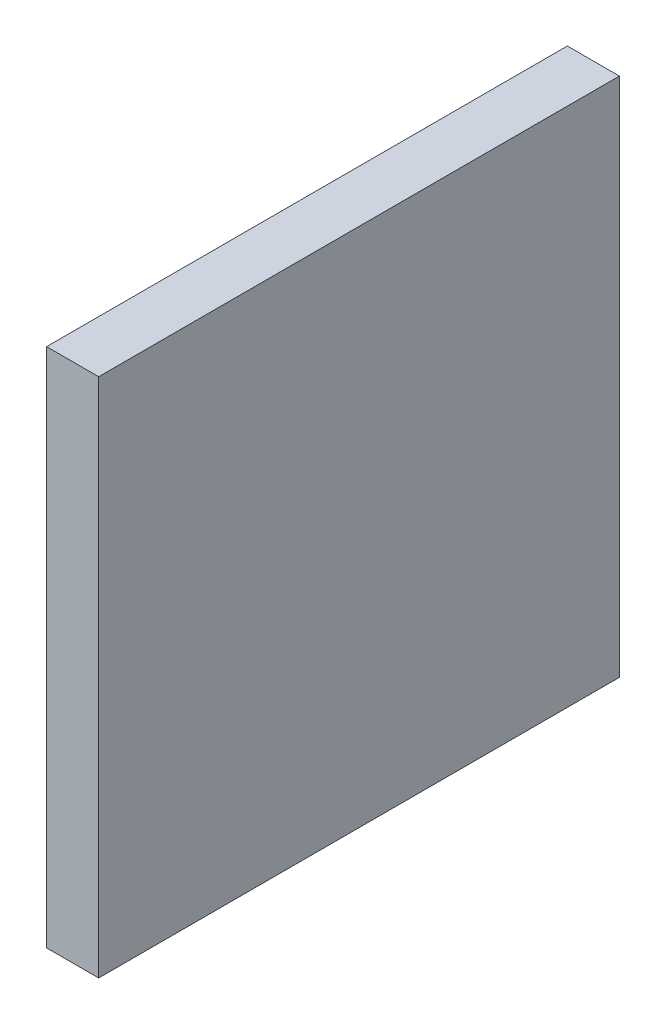
ISO-10303-21;
HEADER;
FILE_DESCRIPTION(('STEP AP214'),'2;1');
FILE_NAME('part.step','',(''),(''),'','','');
FILE_SCHEMA(('AUTOMOTIVE_DESIGN { 1 0 10303 214 1 1 1 1 }'));
ENDSEC;
DATA;
#1=APPLICATION_CONTEXT('core data for automotive mechanical design processes');
#2=APPLICATION_PROTOCOL_DEFINITION('international standard','automotive_design',2000,#1);
#3=PRODUCT_CONTEXT('',#1,'mechanical');
#4=PRODUCT('Part','Part','',(#3));
#5=PRODUCT_RELATED_PRODUCT_CATEGORY('part','',(#4));
#6=PRODUCT_DEFINITION_FORMATION('','',#4);
#7=PRODUCT_DEFINITION_CONTEXT('part definition',#1,'design');
#8=PRODUCT_DEFINITION('design','',#6,#7);
#9=PRODUCT_DEFINITION_SHAPE('','',#8);
#10=(LENGTH_UNIT() NAMED_UNIT(*) SI_UNIT(.MILLI.,.METRE.));
#11=(NAMED_UNIT(*) PLANE_ANGLE_UNIT() SI_UNIT($,.RADIAN.));
#12=(NAMED_UNIT(*) SI_UNIT($,.STERADIAN.) SOLID_ANGLE_UNIT());
#13=UNCERTAINTY_MEASURE_WITH_UNIT(LENGTH_MEASURE(1.E-05),#10,'distance_accuracy_value','');
#14=(GEOMETRIC_REPRESENTATION_CONTEXT(3) GLOBAL_UNCERTAINTY_ASSIGNED_CONTEXT((#13)) GLOBAL_UNIT_ASSIGNED_CONTEXT((#10,
#11,#12)) REPRESENTATION_CONTEXT('',''));
#15=CARTESIAN_POINT('',(0.,0.,0.));
#16=DIRECTION('',(0.,0.,1.));
#17=DIRECTION('',(1.,0.,0.));
#18=AXIS2_PLACEMENT_3D('',#15,#16,#17);
#19=CARTESIAN_POINT('',(10.,0.,0.));
#20=DIRECTION('',(0.,0.,-1.));
#21=DIRECTION('',(0.,1.,0.));
#22=AXIS2_PLACEMENT_3D('',#19,#20,#21);
#23=PLANE('',#22);
#24=DIRECTION('',(0.,-1.,0.));
#25=VECTOR('',#24,1.);
#26=CARTESIAN_POINT('',(0.,0.,0.));
#27=LINE('',#26,#25);
#28=CARTESIAN_POINT('',(0.,100.,0.));
#29=VERTEX_POINT('',#28);
#30=CARTESIAN_POINT('',(0.,0.,0.));
#31=VERTEX_POINT('',#30);
#32=EDGE_CURVE('E105',#29,#31,#27,.T.);
#33=ORIENTED_EDGE('',*,*,#32,.T.);
#34=DIRECTION('',(-1.,0.,0.));
#35=VECTOR('',#34,1.);
#36=CARTESIAN_POINT('',(10.,0.,0.));
#37=LINE('',#36,#35);
#38=CARTESIAN_POINT('',(10.,0.,0.));
#39=VERTEX_POINT('',#38);
#40=EDGE_CURVE('E11',#39,#31,#37,.T.);
#41=ORIENTED_EDGE('',*,*,#40,.F.);
#42=DIRECTION('',(0.,-1.,0.));
#43=VECTOR('',#42,1.);
#44=CARTESIAN_POINT('',(10.,0.,0.));
#45=LINE('',#44,#43);
#46=CARTESIAN_POINT('',(10.,100.,0.));
#47=VERTEX_POINT('',#46);
#48=EDGE_CURVE('E89',#47,#39,#45,.T.);
#49=ORIENTED_EDGE('',*,*,#48,.F.);
#50=DIRECTION('',(-1.,0.,0.));
#51=VECTOR('',#50,1.);
#52=CARTESIAN_POINT('',(10.,100.,0.));
#53=LINE('',#52,#51);
#54=EDGE_CURVE('E98',#47,#29,#53,.T.);
#55=ORIENTED_EDGE('',*,*,#54,.T.);
#56=EDGE_LOOP('',(#33,#41,#49,#55));
#57=FACE_BOUND('',#56,.T.);
#58=ADVANCED_FACE('F39',(#57),#23,.F.);
#59=CARTESIAN_POINT('',(10.,0.,0.));
#60=DIRECTION('',(0.,1.,0.));
#61=DIRECTION('',(0.,0.,1.));
#62=AXIS2_PLACEMENT_3D('',#59,#60,#61);
#63=PLANE('',#62);
#64=DIRECTION('',(0.,0.,-1.));
#65=VECTOR('',#64,1.);
#66=CARTESIAN_POINT('',(0.,0.,0.));
#67=LINE('',#66,#65);
#68=CARTESIAN_POINT('',(0.,0.,-100.));
#69=VERTEX_POINT('',#68);
#70=EDGE_CURVE('E94',#31,#69,#67,.T.);
#71=ORIENTED_EDGE('',*,*,#70,.T.);
#72=DIRECTION('',(-1.,0.,0.));
#73=VECTOR('',#72,1.);
#74=CARTESIAN_POINT('',(10.,0.,-100.));
#75=LINE('',#74,#73);
#76=CARTESIAN_POINT('',(10.,0.,-100.));
#77=VERTEX_POINT('',#76);
#78=EDGE_CURVE('E50',#77,#69,#75,.T.);
#79=ORIENTED_EDGE('',*,*,#78,.F.);
#80=DIRECTION('',(0.,0.,-1.));
#81=VECTOR('',#80,1.);
#82=CARTESIAN_POINT('',(10.,0.,0.));
#83=LINE('',#82,#81);
#84=EDGE_CURVE('E81',#39,#77,#83,.T.);
#85=ORIENTED_EDGE('',*,*,#84,.F.);
#86=ORIENTED_EDGE('',*,*,#40,.T.);
#87=EDGE_LOOP('',(#71,#79,#85,#86));
#88=FACE_BOUND('',#87,.T.);
#89=ADVANCED_FACE('F91',(#88),#63,.F.);
#90=CARTESIAN_POINT('',(10.,0.,-100.));
#91=DIRECTION('',(0.,0.,1.));
#92=DIRECTION('',(0.,-1.,0.));
#93=AXIS2_PLACEMENT_3D('',#90,#91,#92);
#94=PLANE('',#93);
#95=DIRECTION('',(0.,1.,0.));
#96=VECTOR('',#95,1.);
#97=CARTESIAN_POINT('',(0.,0.,-100.));
#98=LINE('',#97,#96);
#99=CARTESIAN_POINT('',(0.,100.,-100.));
#100=VERTEX_POINT('',#99);
#101=EDGE_CURVE('E75',#69,#100,#98,.T.);
#102=ORIENTED_EDGE('',*,*,#101,.T.);
#103=DIRECTION('',(-1.,0.,0.));
#104=VECTOR('',#103,1.);
#105=CARTESIAN_POINT('',(10.,100.,-100.));
#106=LINE('',#105,#104);
#107=CARTESIAN_POINT('',(10.,100.,-100.));
#108=VERTEX_POINT('',#107);
#109=EDGE_CURVE('E92',#108,#100,#106,.T.);
#110=ORIENTED_EDGE('',*,*,#109,.F.);
#111=DIRECTION('',(0.,1.,0.));
#112=VECTOR('',#111,1.);
#113=CARTESIAN_POINT('',(10.,0.,-100.));
#114=LINE('',#113,#112);
#115=EDGE_CURVE('E86',#77,#108,#114,.T.);
#116=ORIENTED_EDGE('',*,*,#115,.F.);
#117=ORIENTED_EDGE('',*,*,#78,.T.);
#118=EDGE_LOOP('',(#102,#110,#116,#117));
#119=FACE_BOUND('',#118,.T.);
#120=ADVANCED_FACE('F96',(#119),#94,.F.);
#121=CARTESIAN_POINT('',(10.,100.,0.));
#122=DIRECTION('',(0.,-1.,0.));
#123=DIRECTION('',(0.,0.,-1.));
#124=AXIS2_PLACEMENT_3D('',#121,#122,#123);
#125=PLANE('',#124);
#126=DIRECTION('',(0.,0.,1.));
#127=VECTOR('',#126,1.);
#128=CARTESIAN_POINT('',(0.,100.,0.));
#129=LINE('',#128,#127);
#130=EDGE_CURVE('E79',#100,#29,#129,.T.);
#131=ORIENTED_EDGE('',*,*,#130,.T.);
#132=ORIENTED_EDGE('',*,*,#54,.F.);
#133=DIRECTION('',(0.,0.,1.));
#134=VECTOR('',#133,1.);
#135=CARTESIAN_POINT('',(10.,100.,0.));
#136=LINE('',#135,#134);
#137=EDGE_CURVE('E54',#108,#47,#136,.T.);
#138=ORIENTED_EDGE('',*,*,#137,.F.);
#139=ORIENTED_EDGE('',*,*,#109,.T.);
#140=EDGE_LOOP('',(#131,#132,#138,#139));
#141=FACE_BOUND('',#140,.T.);
#142=ADVANCED_FACE('F108',(#141),#125,.F.);
#143=CARTESIAN_POINT('',(10.,0.,0.));
#144=DIRECTION('',(-1.,0.,0.));
#145=DIRECTION('',(0.,0.,1.));
#146=AXIS2_PLACEMENT_3D('',#143,#144,#145);
#147=PLANE('',#146);
#148=ORIENTED_EDGE('',*,*,#48,.T.);
#149=ORIENTED_EDGE('',*,*,#84,.T.);
#150=ORIENTED_EDGE('',*,*,#115,.T.);
#151=ORIENTED_EDGE('',*,*,#137,.T.);
#152=EDGE_LOOP('',(#148,#149,#150,#151));
#153=FACE_BOUND('',#152,.T.);
#154=ADVANCED_FACE('F88',(#153),#147,.F.);
#155=CARTESIAN_POINT('',(0.,0.,0.));
#156=DIRECTION('',(-1.,0.,0.));
#157=DIRECTION('',(0.,0.,1.));
#158=AXIS2_PLACEMENT_3D('',#155,#156,#157);
#159=PLANE('',#158);
#160=ORIENTED_EDGE('',*,*,#32,.F.);
#161=ORIENTED_EDGE('',*,*,#130,.F.);
#162=ORIENTED_EDGE('',*,*,#101,.F.);
#163=ORIENTED_EDGE('',*,*,#70,.F.);
#164=EDGE_LOOP('',(#160,#161,#162,#163));
#165=FACE_BOUND('',#164,.T.);
#166=ADVANCED_FACE('F115',(#165),#159,.T.);
#167=CLOSED_SHELL('',(#58,#89,#120,#142,#154,#166));
#168=MANIFOLD_SOLID_BREP('B2',#167);
#169=ADVANCED_BREP_SHAPE_REPRESENTATION('',(#18,#168),#14);
#170=SHAPE_DEFINITION_REPRESENTATION(#9,#169);
ENDSEC;
END-ISO-10303-21;
